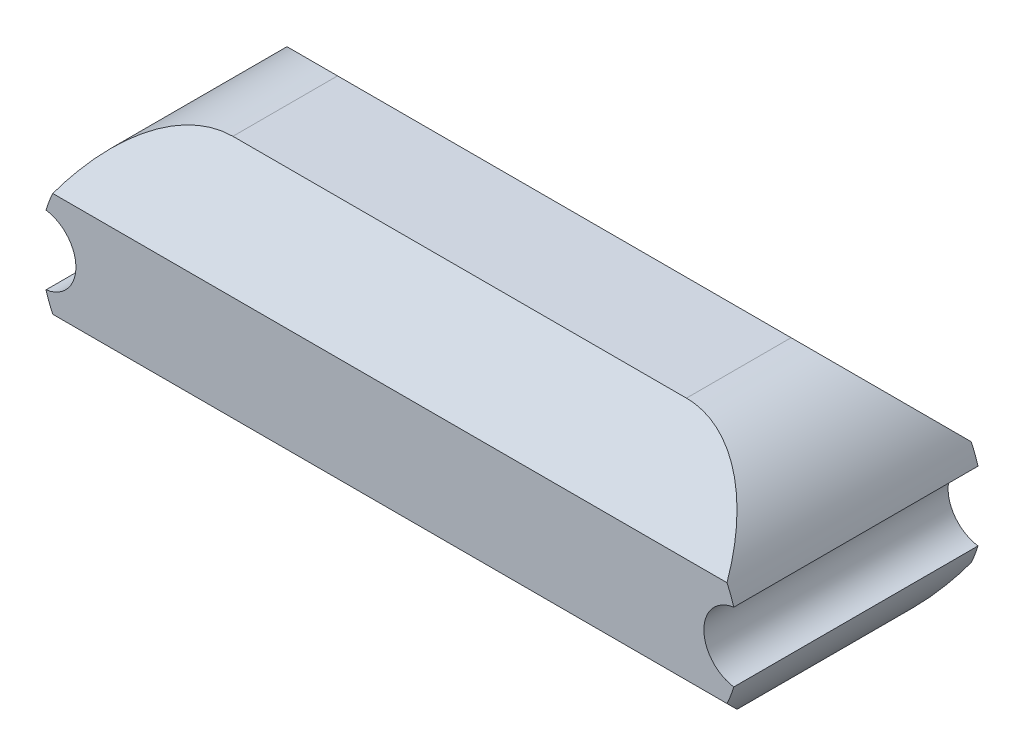
ISO-10303-21;
HEADER;
FILE_DESCRIPTION(('STEP AP214'),'2;1');
FILE_NAME('part.step','',(''),(''),'','','');
FILE_SCHEMA(('AUTOMOTIVE_DESIGN { 1 0 10303 214 1 1 1 1 }'));
ENDSEC;
DATA;
#1=APPLICATION_CONTEXT('core data for automotive mechanical design processes');
#2=APPLICATION_PROTOCOL_DEFINITION('international standard','automotive_design',2000,#1);
#3=PRODUCT_CONTEXT('',#1,'mechanical');
#4=PRODUCT('Part','Part','',(#3));
#5=PRODUCT_RELATED_PRODUCT_CATEGORY('part','',(#4));
#6=PRODUCT_DEFINITION_FORMATION('','',#4);
#7=PRODUCT_DEFINITION_CONTEXT('part definition',#1,'design');
#8=PRODUCT_DEFINITION('design','',#6,#7);
#9=PRODUCT_DEFINITION_SHAPE('','',#8);
#10=(LENGTH_UNIT() NAMED_UNIT(*) SI_UNIT(.MILLI.,.METRE.));
#11=(NAMED_UNIT(*) PLANE_ANGLE_UNIT() SI_UNIT($,.RADIAN.));
#12=(NAMED_UNIT(*) SI_UNIT($,.STERADIAN.) SOLID_ANGLE_UNIT());
#13=UNCERTAINTY_MEASURE_WITH_UNIT(LENGTH_MEASURE(1.E-05),#10,'distance_accuracy_value','');
#14=(GEOMETRIC_REPRESENTATION_CONTEXT(3) GLOBAL_UNCERTAINTY_ASSIGNED_CONTEXT((#13)) GLOBAL_UNIT_ASSIGNED_CONTEXT((#10,
#11,#12)) REPRESENTATION_CONTEXT('',''));
#15=CARTESIAN_POINT('',(0.,0.,0.));
#16=DIRECTION('',(0.,0.,1.));
#17=DIRECTION('',(1.,0.,0.));
#18=AXIS2_PLACEMENT_3D('',#15,#16,#17);
#19=CARTESIAN_POINT('',(-50.,17.5,35.));
#20=DIRECTION('',(0.,-1.,0.));
#21=DIRECTION('',(0.,0.,-1.));
#22=AXIS2_PLACEMENT_3D('',#19,#20,#21);
#23=PLANE('',#22);
#24=DIRECTION('',(0.,0.,-1.));
#25=VECTOR('',#24,1.);
#26=CARTESIAN_POINT('',(-32.5,17.5,35.));
#27=LINE('',#26,#25);
#28=CARTESIAN_POINT('',(-32.5,17.5,10.));
#29=VERTEX_POINT('',#28);
#30=CARTESIAN_POINT('',(-32.5,17.5,25.));
#31=VERTEX_POINT('',#30);
#32=EDGE_CURVE('E217',#29,#31,#27,.F.);
#33=ORIENTED_EDGE('',*,*,#32,.T.);
#34=DIRECTION('',(1.,0.,0.));
#35=VECTOR('',#34,1.);
#36=CARTESIAN_POINT('',(32.5,17.5,25.));
#37=LINE('',#36,#35);
#38=CARTESIAN_POINT('',(32.5,17.5,25.));
#39=VERTEX_POINT('',#38);
#40=EDGE_CURVE('E41',#31,#39,#37,.T.);
#41=ORIENTED_EDGE('',*,*,#40,.T.);
#42=DIRECTION('',(0.,0.,-1.));
#43=VECTOR('',#42,1.);
#44=CARTESIAN_POINT('',(32.5,17.5,35.));
#45=LINE('',#44,#43);
#46=CARTESIAN_POINT('',(32.5,17.5,10.));
#47=VERTEX_POINT('',#46);
#48=EDGE_CURVE('E149',#39,#47,#45,.T.);
#49=ORIENTED_EDGE('',*,*,#48,.T.);
#50=DIRECTION('',(-1.,0.,0.));
#51=VECTOR('',#50,1.);
#52=CARTESIAN_POINT('',(-50.,17.5,10.));
#53=LINE('',#52,#51);
#54=EDGE_CURVE('E161',#47,#29,#53,.T.);
#55=ORIENTED_EDGE('',*,*,#54,.T.);
#56=EDGE_LOOP('',(#33,#41,#49,#55));
#57=FACE_BOUND('',#56,.T.);
#58=ADVANCED_FACE('F33',(#57),#23,.F.);
#59=CARTESIAN_POINT('',(-50.,-17.5,35.));
#60=DIRECTION('',(0.,1.,0.));
#61=DIRECTION('',(0.,0.,1.));
#62=AXIS2_PLACEMENT_3D('',#59,#60,#61);
#63=PLANE('',#62);
#64=DIRECTION('',(0.,0.,-1.));
#65=VECTOR('',#64,1.);
#66=CARTESIAN_POINT('',(-32.5,-17.5,35.));
#67=LINE('',#66,#65);
#68=CARTESIAN_POINT('',(-32.5,-17.5,25.));
#69=VERTEX_POINT('',#68);
#70=CARTESIAN_POINT('',(-32.5,-17.5,10.));
#71=VERTEX_POINT('',#70);
#72=EDGE_CURVE('E221',#69,#71,#67,.T.);
#73=ORIENTED_EDGE('',*,*,#72,.T.);
#74=DIRECTION('',(1.,0.,0.));
#75=VECTOR('',#74,1.);
#76=CARTESIAN_POINT('',(-50.,-17.5,10.));
#77=LINE('',#76,#75);
#78=CARTESIAN_POINT('',(32.5,-17.5,10.));
#79=VERTEX_POINT('',#78);
#80=EDGE_CURVE('E173',#71,#79,#77,.T.);
#81=ORIENTED_EDGE('',*,*,#80,.T.);
#82=DIRECTION('',(0.,0.,-1.));
#83=VECTOR('',#82,1.);
#84=CARTESIAN_POINT('',(32.5,-17.5,35.));
#85=LINE('',#84,#83);
#86=CARTESIAN_POINT('',(32.5,-17.5,25.));
#87=VERTEX_POINT('',#86);
#88=EDGE_CURVE('E147',#79,#87,#85,.F.);
#89=ORIENTED_EDGE('',*,*,#88,.T.);
#90=DIRECTION('',(-1.,0.,0.));
#91=VECTOR('',#90,1.);
#92=CARTESIAN_POINT('',(-32.5,-17.5,25.));
#93=LINE('',#92,#91);
#94=EDGE_CURVE('E171',#87,#69,#93,.T.);
#95=ORIENTED_EDGE('',*,*,#94,.T.);
#96=EDGE_LOOP('',(#73,#81,#89,#95));
#97=FACE_BOUND('',#96,.T.);
#98=ADVANCED_FACE('F241',(#97),#63,.F.);
#99=CARTESIAN_POINT('',(0.,0.,35.));
#100=DIRECTION('',(0.,0.,1.));
#101=DIRECTION('',(1.,0.,0.));
#102=AXIS2_PLACEMENT_3D('',#99,#100,#101);
#103=PLANE('',#102);
#104=CARTESIAN_POINT('',(-32.5,0.,35.));
#105=DIRECTION('',(0.,0.,1.));
#106=DIRECTION('',(1.,0.,0.));
#107=AXIS2_PLACEMENT_3D('',#104,#105,#106);
#108=CIRCLE('',#107,17.5);
#109=CARTESIAN_POINT('',(-49.2857142857143,-4.94871659305393,35.));
#110=VERTEX_POINT('',#109);
#111=CARTESIAN_POINT('',(-48.3113883008419,-7.49999999999998,35.));
#112=VERTEX_POINT('',#111);
#113=EDGE_CURVE('E193',#110,#112,#108,.T.);
#114=ORIENTED_EDGE('',*,*,#113,.T.);
#115=DIRECTION('',(1.,0.,0.));
#116=VECTOR('',#115,1.);
#117=CARTESIAN_POINT('',(32.5,-7.49999999999999,35.));
#118=LINE('',#117,#116);
#119=CARTESIAN_POINT('',(48.3113883008419,-7.49999999999998,35.));
#120=VERTEX_POINT('',#119);
#121=EDGE_CURVE('E188',#112,#120,#118,.T.);
#122=ORIENTED_EDGE('',*,*,#121,.T.);
#123=CARTESIAN_POINT('',(32.5,0.,35.));
#124=DIRECTION('',(0.,0.,1.));
#125=DIRECTION('',(1.,0.,0.));
#126=AXIS2_PLACEMENT_3D('',#123,#124,#125);
#127=CIRCLE('',#126,17.5);
#128=CARTESIAN_POINT('',(49.2857142857143,-4.94871659305393,35.));
#129=VERTEX_POINT('',#128);
#130=EDGE_CURVE('E143',#120,#129,#127,.T.);
#131=ORIENTED_EDGE('',*,*,#130,.T.);
#132=CARTESIAN_POINT('',(50.,0.,35.));
#133=DIRECTION('',(0.,0.,1.));
#134=DIRECTION('',(1.,0.,0.));
#135=AXIS2_PLACEMENT_3D('',#132,#133,#134);
#136=CIRCLE('',#135,5.);
#137=CARTESIAN_POINT('',(49.2857142857143,4.94871659305394,35.));
#138=VERTEX_POINT('',#137);
#139=EDGE_CURVE('E125',#138,#129,#136,.T.);
#140=ORIENTED_EDGE('',*,*,#139,.F.);
#141=CARTESIAN_POINT('',(32.5,0.,35.));
#142=DIRECTION('',(0.,0.,1.));
#143=DIRECTION('',(1.,0.,0.));
#144=AXIS2_PLACEMENT_3D('',#141,#142,#143);
#145=CIRCLE('',#144,17.5);
#146=CARTESIAN_POINT('',(48.3113883008419,7.5,35.));
#147=VERTEX_POINT('',#146);
#148=EDGE_CURVE('E139',#138,#147,#145,.T.);
#149=ORIENTED_EDGE('',*,*,#148,.T.);
#150=DIRECTION('',(-1.,0.,0.));
#151=VECTOR('',#150,1.);
#152=CARTESIAN_POINT('',(-32.5,7.5,35.));
#153=LINE('',#152,#151);
#154=CARTESIAN_POINT('',(-48.3113883008419,7.5,35.));
#155=VERTEX_POINT('',#154);
#156=EDGE_CURVE('E186',#147,#155,#153,.T.);
#157=ORIENTED_EDGE('',*,*,#156,.T.);
#158=CARTESIAN_POINT('',(-32.5,0.,35.));
#159=DIRECTION('',(0.,0.,1.));
#160=DIRECTION('',(1.,0.,0.));
#161=AXIS2_PLACEMENT_3D('',#158,#159,#160);
#162=CIRCLE('',#161,17.5);
#163=CARTESIAN_POINT('',(-49.2857142857143,4.94871659305394,35.));
#164=VERTEX_POINT('',#163);
#165=EDGE_CURVE('E219',#155,#164,#162,.T.);
#166=ORIENTED_EDGE('',*,*,#165,.T.);
#167=CARTESIAN_POINT('',(-50.,0.,35.));
#168=DIRECTION('',(0.,0.,1.));
#169=DIRECTION('',(1.,0.,0.));
#170=AXIS2_PLACEMENT_3D('',#167,#168,#169);
#171=CIRCLE('',#170,5.);
#172=EDGE_CURVE('E132',#110,#164,#171,.T.);
#173=ORIENTED_EDGE('',*,*,#172,.F.);
#174=EDGE_LOOP('',(#114,#122,#131,#140,#149,#157,#166,#173));
#175=FACE_BOUND('',#174,.T.);
#176=ADVANCED_FACE('F137',(#175),#103,.T.);
#177=CARTESIAN_POINT('',(0.,0.,0.));
#178=DIRECTION('',(0.,0.,1.));
#179=DIRECTION('',(1.,0.,0.));
#180=AXIS2_PLACEMENT_3D('',#177,#178,#179);
#181=PLANE('',#180);
#182=CARTESIAN_POINT('',(32.5,0.,0.));
#183=DIRECTION('',(0.,0.,1.));
#184=DIRECTION('',(1.,0.,0.));
#185=AXIS2_PLACEMENT_3D('',#182,#183,#184);
#186=CIRCLE('',#185,17.5);
#187=CARTESIAN_POINT('',(49.2857142857143,-4.94871659305393,0.));
#188=VERTEX_POINT('',#187);
#189=CARTESIAN_POINT('',(48.3113883008419,-7.49999999999993,0.));
#190=VERTEX_POINT('',#189);
#191=EDGE_CURVE('E152',#188,#190,#186,.F.);
#192=ORIENTED_EDGE('',*,*,#191,.T.);
#193=DIRECTION('',(-1.,0.,0.));
#194=VECTOR('',#193,1.);
#195=CARTESIAN_POINT('',(0.,-7.49999999999993,0.));
#196=LINE('',#195,#194);
#197=CARTESIAN_POINT('',(-48.3113883008419,-7.49999999999993,0.));
#198=VERTEX_POINT('',#197);
#199=EDGE_CURVE('E180',#190,#198,#196,.T.);
#200=ORIENTED_EDGE('',*,*,#199,.T.);
#201=CARTESIAN_POINT('',(-32.5,0.,0.));
#202=DIRECTION('',(0.,0.,1.));
#203=DIRECTION('',(1.,0.,0.));
#204=AXIS2_PLACEMENT_3D('',#201,#202,#203);
#205=CIRCLE('',#204,17.5);
#206=CARTESIAN_POINT('',(-49.2857142857143,-4.94871659305393,0.));
#207=VERTEX_POINT('',#206);
#208=EDGE_CURVE('E224',#198,#207,#205,.F.);
#209=ORIENTED_EDGE('',*,*,#208,.T.);
#210=CARTESIAN_POINT('',(-50.,0.,0.));
#211=DIRECTION('',(0.,0.,1.));
#212=DIRECTION('',(1.,0.,0.));
#213=AXIS2_PLACEMENT_3D('',#210,#211,#212);
#214=CIRCLE('',#213,5.);
#215=CARTESIAN_POINT('',(-49.2857142857143,4.94871659305394,0.));
#216=VERTEX_POINT('',#215);
#217=EDGE_CURVE('E207',#207,#216,#214,.T.);
#218=ORIENTED_EDGE('',*,*,#217,.T.);
#219=CARTESIAN_POINT('',(-32.5,0.,0.));
#220=DIRECTION('',(0.,0.,1.));
#221=DIRECTION('',(1.,0.,0.));
#222=AXIS2_PLACEMENT_3D('',#219,#220,#221);
#223=CIRCLE('',#222,17.5);
#224=CARTESIAN_POINT('',(-48.3113883008419,7.49999999999994,0.));
#225=VERTEX_POINT('',#224);
#226=EDGE_CURVE('E214',#216,#225,#223,.F.);
#227=ORIENTED_EDGE('',*,*,#226,.T.);
#228=DIRECTION('',(1.,0.,0.));
#229=VECTOR('',#228,1.);
#230=CARTESIAN_POINT('',(0.,7.49999999999994,0.));
#231=LINE('',#230,#229);
#232=CARTESIAN_POINT('',(48.3113883008419,7.49999999999994,0.));
#233=VERTEX_POINT('',#232);
#234=EDGE_CURVE('E166',#225,#233,#231,.T.);
#235=ORIENTED_EDGE('',*,*,#234,.T.);
#236=CARTESIAN_POINT('',(32.5,0.,0.));
#237=DIRECTION('',(0.,0.,1.));
#238=DIRECTION('',(1.,0.,0.));
#239=AXIS2_PLACEMENT_3D('',#236,#237,#238);
#240=CIRCLE('',#239,17.5);
#241=CARTESIAN_POINT('',(49.2857142857143,4.94871659305394,0.));
#242=VERTEX_POINT('',#241);
#243=EDGE_CURVE('E204',#233,#242,#240,.F.);
#244=ORIENTED_EDGE('',*,*,#243,.T.);
#245=CARTESIAN_POINT('',(50.,0.,0.));
#246=DIRECTION('',(0.,0.,1.));
#247=DIRECTION('',(1.,0.,0.));
#248=AXIS2_PLACEMENT_3D('',#245,#246,#247);
#249=CIRCLE('',#248,5.);
#250=EDGE_CURVE('E128',#242,#188,#249,.T.);
#251=ORIENTED_EDGE('',*,*,#250,.T.);
#252=EDGE_LOOP('',(#192,#200,#209,#218,#227,#235,#244,#251));
#253=FACE_BOUND('',#252,.T.);
#254=ADVANCED_FACE('F202',(#253),#181,.F.);
#255=CARTESIAN_POINT('',(-32.5,0.,35.));
#256=DIRECTION('',(0.,0.,-1.));
#257=DIRECTION('',(-1.,0.,0.));
#258=AXIS2_PLACEMENT_3D('',#255,#256,#257);
#259=CYLINDRICAL_SURFACE('',#258,17.5);
#260=ORIENTED_EDGE('',*,*,#165,.F.);
#261=CARTESIAN_POINT('',(-32.5,0.,42.5));
#262=DIRECTION('',(0.,0.707106781186549,0.707106781186547));
#263=DIRECTION('',(0.,0.707106781186547,-0.707106781186549));
#264=AXIS2_PLACEMENT_3D('',#261,#262,#263);
#265=ELLIPSE('',#264,24.7487373415292,17.5);
#266=EDGE_CURVE('E55',#155,#31,#265,.F.);
#267=ORIENTED_EDGE('',*,*,#266,.T.);
#268=ORIENTED_EDGE('',*,*,#32,.F.);
#269=CARTESIAN_POINT('',(-32.5,0.,-7.4999999999999));
#270=DIRECTION('',(0.,-0.707106781186546,0.707106781186549));
#271=DIRECTION('',(0.,-0.707106781186549,-0.707106781186546));
#272=AXIS2_PLACEMENT_3D('',#269,#270,#271);
#273=ELLIPSE('',#272,24.7487373415291,17.5);
#274=EDGE_CURVE('E164',#29,#225,#273,.T.);
#275=ORIENTED_EDGE('',*,*,#274,.T.);
#276=ORIENTED_EDGE('',*,*,#226,.F.);
#277=DIRECTION('',(0.,0.,1.));
#278=VECTOR('',#277,1.);
#279=CARTESIAN_POINT('',(-49.2857142857143,4.94871659305394,17.5));
#280=LINE('',#279,#278);
#281=EDGE_CURVE('E210',#164,#216,#280,.F.);
#282=ORIENTED_EDGE('',*,*,#281,.F.);
#283=EDGE_LOOP('',(#260,#267,#268,#275,#276,#282));
#284=FACE_BOUND('',#283,.T.);
#285=ADVANCED_FACE('F262',(#284),#259,.T.);
#286=CARTESIAN_POINT('',(-32.5,0.,35.));
#287=DIRECTION('',(0.,0.,-1.));
#288=DIRECTION('',(-1.,0.,0.));
#289=AXIS2_PLACEMENT_3D('',#286,#287,#288);
#290=CYLINDRICAL_SURFACE('',#289,17.5);
#291=ORIENTED_EDGE('',*,*,#208,.F.);
#292=CARTESIAN_POINT('',(-32.5,0.,-7.4999999999999));
#293=DIRECTION('',(0.,0.707106781186546,0.707106781186549));
#294=DIRECTION('',(0.,0.707106781186549,-0.707106781186546));
#295=AXIS2_PLACEMENT_3D('',#292,#293,#294);
#296=ELLIPSE('',#295,24.7487373415291,17.5);
#297=EDGE_CURVE('E184',#198,#71,#296,.T.);
#298=ORIENTED_EDGE('',*,*,#297,.T.);
#299=ORIENTED_EDGE('',*,*,#72,.F.);
#300=CARTESIAN_POINT('',(-32.5,0.,42.5));
#301=DIRECTION('',(0.,-0.707106781186549,0.707106781186547));
#302=DIRECTION('',(0.,-0.707106781186547,-0.707106781186549));
#303=AXIS2_PLACEMENT_3D('',#300,#301,#302);
#304=ELLIPSE('',#303,24.7487373415292,17.5);
#305=EDGE_CURVE('E182',#69,#112,#304,.F.);
#306=ORIENTED_EDGE('',*,*,#305,.T.);
#307=ORIENTED_EDGE('',*,*,#113,.F.);
#308=DIRECTION('',(0.,0.,1.));
#309=VECTOR('',#308,1.);
#310=CARTESIAN_POINT('',(-49.2857142857143,-4.94871659305393,17.5));
#311=LINE('',#310,#309);
#312=EDGE_CURVE('E157',#207,#110,#311,.T.);
#313=ORIENTED_EDGE('',*,*,#312,.F.);
#314=EDGE_LOOP('',(#291,#298,#299,#306,#307,#313));
#315=FACE_BOUND('',#314,.T.);
#316=ADVANCED_FACE('F236',(#315),#290,.T.);
#317=CARTESIAN_POINT('',(32.5,0.,35.));
#318=DIRECTION('',(0.,0.,-1.));
#319=DIRECTION('',(-1.,0.,0.));
#320=AXIS2_PLACEMENT_3D('',#317,#318,#319);
#321=CYLINDRICAL_SURFACE('',#320,17.5);
#322=ORIENTED_EDGE('',*,*,#48,.F.);
#323=CARTESIAN_POINT('',(32.5,0.,42.5));
#324=DIRECTION('',(0.,0.707106781186549,0.707106781186547));
#325=DIRECTION('',(0.,0.707106781186547,-0.707106781186549));
#326=AXIS2_PLACEMENT_3D('',#323,#324,#325);
#327=ELLIPSE('',#326,24.7487373415292,17.5);
#328=EDGE_CURVE('E11',#39,#147,#327,.F.);
#329=ORIENTED_EDGE('',*,*,#328,.T.);
#330=ORIENTED_EDGE('',*,*,#148,.F.);
#331=DIRECTION('',(0.,0.,1.));
#332=VECTOR('',#331,1.);
#333=CARTESIAN_POINT('',(49.2857142857143,4.94871659305394,17.5));
#334=LINE('',#333,#332);
#335=EDGE_CURVE('E122',#242,#138,#334,.T.);
#336=ORIENTED_EDGE('',*,*,#335,.F.);
#337=ORIENTED_EDGE('',*,*,#243,.F.);
#338=CARTESIAN_POINT('',(32.5,0.,-7.4999999999999));
#339=DIRECTION('',(0.,-0.707106781186546,0.707106781186549));
#340=DIRECTION('',(0.,-0.707106781186549,-0.707106781186546));
#341=AXIS2_PLACEMENT_3D('',#338,#339,#340);
#342=ELLIPSE('',#341,24.7487373415291,17.5);
#343=EDGE_CURVE('E168',#233,#47,#342,.T.);
#344=ORIENTED_EDGE('',*,*,#343,.T.);
#345=EDGE_LOOP('',(#322,#329,#330,#336,#337,#344));
#346=FACE_BOUND('',#345,.T.);
#347=ADVANCED_FACE('F145',(#346),#321,.T.);
#348=CARTESIAN_POINT('',(32.5,0.,35.));
#349=DIRECTION('',(0.,0.,-1.));
#350=DIRECTION('',(-1.,0.,0.));
#351=AXIS2_PLACEMENT_3D('',#348,#349,#350);
#352=CYLINDRICAL_SURFACE('',#351,17.5);
#353=ORIENTED_EDGE('',*,*,#88,.F.);
#354=CARTESIAN_POINT('',(32.5,0.,-7.4999999999999));
#355=DIRECTION('',(0.,0.707106781186546,0.707106781186549));
#356=DIRECTION('',(0.,0.707106781186549,-0.707106781186546));
#357=AXIS2_PLACEMENT_3D('',#354,#355,#356);
#358=ELLIPSE('',#357,24.7487373415291,17.5);
#359=EDGE_CURVE('E178',#79,#190,#358,.T.);
#360=ORIENTED_EDGE('',*,*,#359,.T.);
#361=ORIENTED_EDGE('',*,*,#191,.F.);
#362=DIRECTION('',(0.,0.,1.));
#363=VECTOR('',#362,1.);
#364=CARTESIAN_POINT('',(49.2857142857143,-4.94871659305393,17.5));
#365=LINE('',#364,#363);
#366=EDGE_CURVE('E159',#129,#188,#365,.F.);
#367=ORIENTED_EDGE('',*,*,#366,.F.);
#368=ORIENTED_EDGE('',*,*,#130,.F.);
#369=CARTESIAN_POINT('',(32.5,0.,42.5));
#370=DIRECTION('',(0.,-0.707106781186549,0.707106781186547));
#371=DIRECTION('',(0.,-0.707106781186547,-0.707106781186549));
#372=AXIS2_PLACEMENT_3D('',#369,#370,#371);
#373=ELLIPSE('',#372,24.7487373415292,17.5);
#374=EDGE_CURVE('E176',#120,#87,#373,.F.);
#375=ORIENTED_EDGE('',*,*,#374,.T.);
#376=EDGE_LOOP('',(#353,#360,#361,#367,#368,#375));
#377=FACE_BOUND('',#376,.T.);
#378=ADVANCED_FACE('F198',(#377),#352,.T.);
#379=CARTESIAN_POINT('',(-50.,0.,0.));
#380=DIRECTION('',(0.,0.,1.));
#381=DIRECTION('',(1.,0.,0.));
#382=AXIS2_PLACEMENT_3D('',#379,#380,#381);
#383=CYLINDRICAL_SURFACE('',#382,5.);
#384=ORIENTED_EDGE('',*,*,#281,.T.);
#385=ORIENTED_EDGE('',*,*,#217,.F.);
#386=ORIENTED_EDGE('',*,*,#312,.T.);
#387=ORIENTED_EDGE('',*,*,#172,.T.);
#388=EDGE_LOOP('',(#384,#385,#386,#387));
#389=FACE_BOUND('',#388,.T.);
#390=ADVANCED_FACE('F234',(#389),#383,.F.);
#391=CARTESIAN_POINT('',(50.,0.,0.));
#392=DIRECTION('',(0.,0.,1.));
#393=DIRECTION('',(1.,0.,0.));
#394=AXIS2_PLACEMENT_3D('',#391,#392,#393);
#395=CYLINDRICAL_SURFACE('',#394,5.);
#396=ORIENTED_EDGE('',*,*,#335,.T.);
#397=ORIENTED_EDGE('',*,*,#139,.T.);
#398=ORIENTED_EDGE('',*,*,#366,.T.);
#399=ORIENTED_EDGE('',*,*,#250,.F.);
#400=EDGE_LOOP('',(#396,#397,#398,#399));
#401=FACE_BOUND('',#400,.T.);
#402=ADVANCED_FACE('F124',(#401),#395,.F.);
#403=CARTESIAN_POINT('',(-50.,17.5,10.));
#404=DIRECTION('',(0.,-0.707106781186546,0.707106781186549));
#405=DIRECTION('',(-1.,0.,0.));
#406=AXIS2_PLACEMENT_3D('',#403,#404,#405);
#407=PLANE('',#406);
#408=ORIENTED_EDGE('',*,*,#343,.F.);
#409=ORIENTED_EDGE('',*,*,#234,.F.);
#410=ORIENTED_EDGE('',*,*,#274,.F.);
#411=ORIENTED_EDGE('',*,*,#54,.F.);
#412=EDGE_LOOP('',(#408,#409,#410,#411));
#413=FACE_BOUND('',#412,.T.);
#414=ADVANCED_FACE('F246',(#413),#407,.F.);
#415=CARTESIAN_POINT('',(-50.,-17.5,10.));
#416=DIRECTION('',(0.,0.707106781186546,0.707106781186549));
#417=DIRECTION('',(1.,0.,0.));
#418=AXIS2_PLACEMENT_3D('',#415,#416,#417);
#419=PLANE('',#418);
#420=ORIENTED_EDGE('',*,*,#297,.F.);
#421=ORIENTED_EDGE('',*,*,#199,.F.);
#422=ORIENTED_EDGE('',*,*,#359,.F.);
#423=ORIENTED_EDGE('',*,*,#80,.F.);
#424=EDGE_LOOP('',(#420,#421,#422,#423));
#425=FACE_BOUND('',#424,.T.);
#426=ADVANCED_FACE('F244',(#425),#419,.F.);
#427=CARTESIAN_POINT('',(0.,-7.49999999999999,35.));
#428=DIRECTION('',(0.,-0.707106781186549,0.707106781186547));
#429=DIRECTION('',(-1.,0.,0.));
#430=AXIS2_PLACEMENT_3D('',#427,#428,#429);
#431=PLANE('',#430);
#432=ORIENTED_EDGE('',*,*,#305,.F.);
#433=ORIENTED_EDGE('',*,*,#94,.F.);
#434=ORIENTED_EDGE('',*,*,#374,.F.);
#435=ORIENTED_EDGE('',*,*,#121,.F.);
#436=EDGE_LOOP('',(#432,#433,#434,#435));
#437=FACE_BOUND('',#436,.T.);
#438=ADVANCED_FACE('F239',(#437),#431,.T.);
#439=CARTESIAN_POINT('',(0.,7.5,35.));
#440=DIRECTION('',(0.,0.707106781186549,0.707106781186547));
#441=DIRECTION('',(1.,0.,0.));
#442=AXIS2_PLACEMENT_3D('',#439,#440,#441);
#443=PLANE('',#442);
#444=ORIENTED_EDGE('',*,*,#328,.F.);
#445=ORIENTED_EDGE('',*,*,#40,.F.);
#446=ORIENTED_EDGE('',*,*,#266,.F.);
#447=ORIENTED_EDGE('',*,*,#156,.F.);
#448=EDGE_LOOP('',(#444,#445,#446,#447));
#449=FACE_BOUND('',#448,.T.);
#450=ADVANCED_FACE('F35',(#449),#443,.T.);
#451=CLOSED_SHELL('',(#58,#98,#176,#254,#285,#316,#347,#378,#390,#402,#414,#426,#438,#450));
#452=MANIFOLD_SOLID_BREP('B2',#451);
#453=ADVANCED_BREP_SHAPE_REPRESENTATION('',(#18,#452),#14);
#454=SHAPE_DEFINITION_REPRESENTATION(#9,#453);
ENDSEC;
END-ISO-10303-21;
